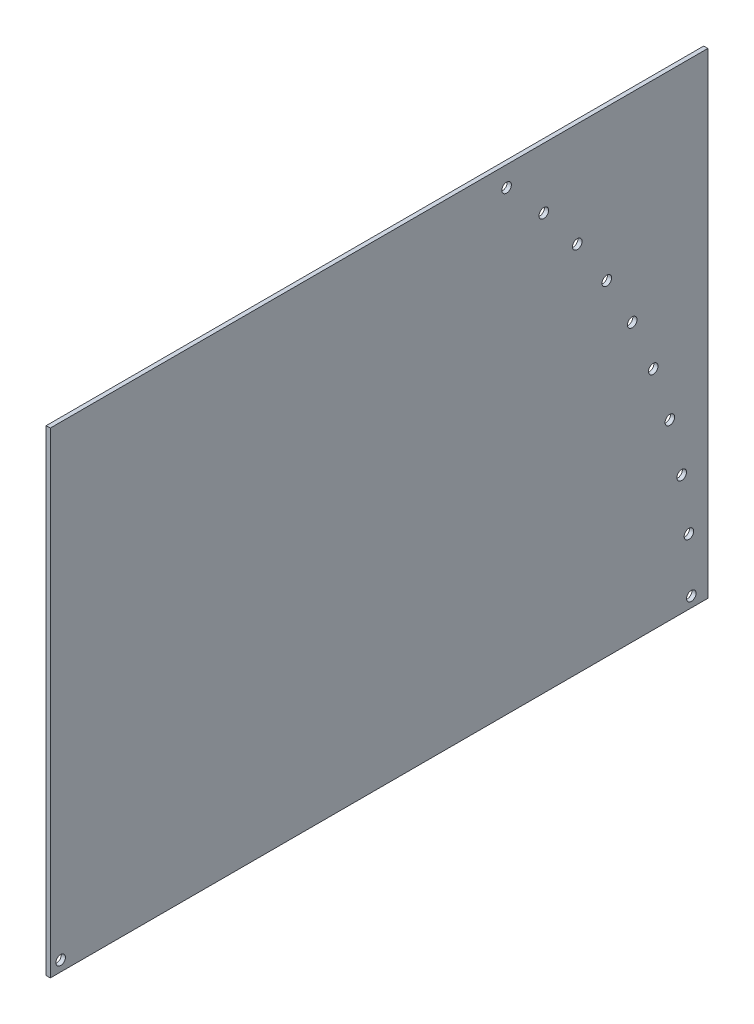
ISO-10303-21;
HEADER;
FILE_DESCRIPTION(('STEP AP214'),'2;1');
FILE_NAME('part.step','',(''),(''),'','','');
FILE_SCHEMA(('AUTOMOTIVE_DESIGN { 1 0 10303 214 1 1 1 1 }'));
ENDSEC;
DATA;
#1=APPLICATION_CONTEXT('core data for automotive mechanical design processes');
#2=APPLICATION_PROTOCOL_DEFINITION('international standard','automotive_design',2000,#1);
#3=PRODUCT_CONTEXT('',#1,'mechanical');
#4=PRODUCT('Part','Part','',(#3));
#5=PRODUCT_RELATED_PRODUCT_CATEGORY('part','',(#4));
#6=PRODUCT_DEFINITION_FORMATION('','',#4);
#7=PRODUCT_DEFINITION_CONTEXT('part definition',#1,'design');
#8=PRODUCT_DEFINITION('design','',#6,#7);
#9=PRODUCT_DEFINITION_SHAPE('','',#8);
#10=(LENGTH_UNIT() NAMED_UNIT(*) SI_UNIT(.MILLI.,.METRE.));
#11=(NAMED_UNIT(*) PLANE_ANGLE_UNIT() SI_UNIT($,.RADIAN.));
#12=(NAMED_UNIT(*) SI_UNIT($,.STERADIAN.) SOLID_ANGLE_UNIT());
#13=UNCERTAINTY_MEASURE_WITH_UNIT(LENGTH_MEASURE(1.E-05),#10,'distance_accuracy_value','');
#14=(GEOMETRIC_REPRESENTATION_CONTEXT(3) GLOBAL_UNCERTAINTY_ASSIGNED_CONTEXT((#13)) GLOBAL_UNIT_ASSIGNED_CONTEXT((#10,
#11,#12)) REPRESENTATION_CONTEXT('',''));
#15=CARTESIAN_POINT('',(0.,0.,0.));
#16=DIRECTION('',(0.,0.,1.));
#17=DIRECTION('',(1.,0.,0.));
#18=AXIS2_PLACEMENT_3D('',#15,#16,#17);
#19=CARTESIAN_POINT('',(2.54,0.,0.));
#20=DIRECTION('',(-1.,0.,0.));
#21=DIRECTION('',(0.,0.,1.));
#22=AXIS2_PLACEMENT_3D('',#19,#20,#21);
#23=PLANE('',#22);
#24=DIRECTION('',(0.,-1.,0.));
#25=VECTOR('',#24,1.);
#26=CARTESIAN_POINT('',(2.54,0.,0.));
#27=LINE('',#26,#25);
#28=CARTESIAN_POINT('',(2.54,291.062175581179,0.));
#29=VERTEX_POINT('',#28);
#30=CARTESIAN_POINT('',(2.54,0.,0.));
#31=VERTEX_POINT('',#30);
#32=EDGE_CURVE('E88',#29,#31,#27,.T.);
#33=ORIENTED_EDGE('',*,*,#32,.T.);
#34=DIRECTION('',(0.,0.,-1.));
#35=VECTOR('',#34,1.);
#36=CARTESIAN_POINT('',(2.54,0.,0.));
#37=LINE('',#36,#35);
#38=CARTESIAN_POINT('',(2.54,0.,-401.869209934692));
#39=VERTEX_POINT('',#38);
#40=EDGE_CURVE('E83',#31,#39,#37,.T.);
#41=ORIENTED_EDGE('',*,*,#40,.T.);
#42=DIRECTION('',(0.,1.,0.));
#43=VECTOR('',#42,1.);
#44=CARTESIAN_POINT('',(2.54,0.,-401.869209934692));
#45=LINE('',#44,#43);
#46=CARTESIAN_POINT('',(2.54,291.062175581179,-401.869209934692));
#47=VERTEX_POINT('',#46);
#48=EDGE_CURVE('E86',#39,#47,#45,.T.);
#49=ORIENTED_EDGE('',*,*,#48,.T.);
#50=DIRECTION('',(0.,0.,1.));
#51=VECTOR('',#50,1.);
#52=CARTESIAN_POINT('',(2.54,291.062175581179,0.));
#53=LINE('',#52,#51);
#54=EDGE_CURVE('E53',#47,#29,#53,.T.);
#55=ORIENTED_EDGE('',*,*,#54,.T.);
#56=EDGE_LOOP('',(#33,#41,#49,#55));
#57=FACE_BOUND('',#56,.T.);
#58=CARTESIAN_POINT('',(2.54,6.35,-6.35));
#59=DIRECTION('',(1.,0.,0.));
#60=DIRECTION('',(0.,0.,-1.));
#61=AXIS2_PLACEMENT_3D('',#58,#59,#60);
#62=CIRCLE('',#61,2.921);
#63=CARTESIAN_POINT('',(2.54,6.35,-9.271));
#64=VERTEX_POINT('',#63);
#65=EDGE_CURVE('E103',#64,#64,#62,.T.);
#66=ORIENTED_EDGE('',*,*,#65,.F.);
#67=EDGE_LOOP('',(#66));
#68=FACE_BOUND('',#67,.T.);
#69=CARTESIAN_POINT('',(2.54,6.35,-391.7499912));
#70=DIRECTION('',(1.,0.,0.));
#71=DIRECTION('',(0.,0.,-1.));
#72=AXIS2_PLACEMENT_3D('',#69,#70,#71);
#73=CIRCLE('',#72,2.921);
#74=CARTESIAN_POINT('',(2.54,6.35,-394.6709912));
#75=VERTEX_POINT('',#74);
#76=EDGE_CURVE('E118',#75,#75,#73,.T.);
#77=ORIENTED_EDGE('',*,*,#76,.F.);
#78=EDGE_LOOP('',(#77));
#79=FACE_BOUND('',#78,.T.);
#80=CARTESIAN_POINT('',(2.54,73.274006144731,-385.894899344597));
#81=DIRECTION('',(1.,0.,0.));
#82=DIRECTION('',(0.,0.,-1.));
#83=AXIS2_PLACEMENT_3D('',#80,#81,#82);
#84=CIRCLE('',#83,2.921);
#85=CARTESIAN_POINT('',(2.54,73.274006144731,-388.815899344597));
#86=VERTEX_POINT('',#85);
#87=EDGE_CURVE('E124',#86,#86,#84,.T.);
#88=ORIENTED_EDGE('',*,*,#87,.F.);
#89=EDGE_LOOP('',(#88));
#90=FACE_BOUND('',#89,.T.);
#91=CARTESIAN_POINT('',(2.54,39.939822487977,-390.283427878045));
#92=DIRECTION('',(1.,0.,0.));
#93=DIRECTION('',(0.,0.,-1.));
#94=AXIS2_PLACEMENT_3D('',#91,#92,#93);
#95=CIRCLE('',#94,2.921);
#96=CARTESIAN_POINT('',(2.54,39.939822487977,-393.204427878045));
#97=VERTEX_POINT('',#96);
#98=EDGE_CURVE('E130',#97,#97,#95,.T.);
#99=ORIENTED_EDGE('',*,*,#98,.F.);
#100=EDGE_LOOP('',(#99));
#101=FACE_BOUND('',#100,.T.);
#102=CARTESIAN_POINT('',(2.54,106.098857704904,-378.61780495166));
#103=DIRECTION('',(1.,0.,0.));
#104=DIRECTION('',(0.,0.,-1.));
#105=AXIS2_PLACEMENT_3D('',#102,#103,#104);
#106=CIRCLE('',#105,2.921);
#107=CARTESIAN_POINT('',(2.54,106.098857704904,-381.53880495166));
#108=VERTEX_POINT('',#107);
#109=EDGE_CURVE('E136',#108,#108,#106,.T.);
#110=ORIENTED_EDGE('',*,*,#109,.F.);
#111=EDGE_LOOP('',(#110));
#112=FACE_BOUND('',#111,.T.);
#113=CARTESIAN_POINT('',(2.54,138.164560227936,-368.507527781594));
#114=DIRECTION('',(1.,0.,0.));
#115=DIRECTION('',(0.,0.,-1.));
#116=AXIS2_PLACEMENT_3D('',#113,#114,#115);
#117=CIRCLE('',#116,2.921);
#118=CARTESIAN_POINT('',(2.54,138.164560227936,-371.428527781594));
#119=VERTEX_POINT('',#118);
#120=EDGE_CURVE('E142',#119,#119,#117,.T.);
#121=ORIENTED_EDGE('',*,*,#120,.F.);
#122=EDGE_LOOP('',(#121));
#123=FACE_BOUND('',#122,.T.);
#124=CARTESIAN_POINT('',(2.54,169.227074355825,-355.641013148416));
#125=DIRECTION('',(1.,0.,0.));
#126=DIRECTION('',(0.,0.,-1.));
#127=AXIS2_PLACEMENT_3D('',#124,#125,#126);
#128=CIRCLE('',#127,2.92100000000006);
#129=CARTESIAN_POINT('',(2.54,169.227074355825,-358.562013148416));
#130=VERTEX_POINT('',#129);
#131=EDGE_CURVE('E148',#130,#130,#128,.T.);
#132=ORIENTED_EDGE('',*,*,#131,.F.);
#133=EDGE_LOOP('',(#132));
#134=FACE_BOUND('',#133,.T.);
#135=CARTESIAN_POINT('',(2.54,199.0499956,-340.116182997499));
#136=DIRECTION('',(1.,0.,0.));
#137=DIRECTION('',(0.,0.,-1.));
#138=AXIS2_PLACEMENT_3D('',#135,#136,#137);
#139=CIRCLE('',#138,2.92099999999994);
#140=CARTESIAN_POINT('',(2.54,199.0499956,-343.037182997499));
#141=VERTEX_POINT('',#140);
#142=EDGE_CURVE('E154',#141,#141,#139,.T.);
#143=ORIENTED_EDGE('',*,*,#142,.F.);
#144=EDGE_LOOP('',(#143));
#145=FACE_BOUND('',#144,.T.);
#146=CARTESIAN_POINT('',(2.54,227.406353522221,-322.051190660439));
#147=DIRECTION('',(1.,0.,0.));
#148=DIRECTION('',(0.,0.,-1.));
#149=AXIS2_PLACEMENT_3D('',#146,#147,#148);
#150=CIRCLE('',#149,2.92100000000006);
#151=CARTESIAN_POINT('',(2.54,227.406353522221,-324.972190660439));
#152=VERTEX_POINT('',#151);
#153=EDGE_CURVE('E160',#152,#152,#150,.T.);
#154=ORIENTED_EDGE('',*,*,#153,.F.);
#155=EDGE_LOOP('',(#154));
#156=FACE_BOUND('',#155,.T.);
#157=CARTESIAN_POINT('',(2.54,254.080339116662,-301.583521636863));
#158=DIRECTION('',(1.,0.,0.));
#159=DIRECTION('',(0.,0.,-1.));
#160=AXIS2_PLACEMENT_3D('',#157,#158,#159);
#161=CIRCLE('',#160,2.92099999999994);
#162=CARTESIAN_POINT('',(2.54,254.080339116662,-304.504521636863));
#163=VERTEX_POINT('',#162);
#164=EDGE_CURVE('E166',#163,#163,#161,.T.);
#165=ORIENTED_EDGE('',*,*,#164,.F.);
#166=EDGE_LOOP('',(#165));
#167=FACE_BOUND('',#166,.T.);
#168=CARTESIAN_POINT('',(2.54,278.868947246756,-278.868947246755));
#169=DIRECTION('',(1.,0.,0.));
#170=DIRECTION('',(0.,0.,-1.));
#171=AXIS2_PLACEMENT_3D('',#168,#169,#170);
#172=CIRCLE('',#171,2.9210000000001);
#173=CARTESIAN_POINT('',(2.54,278.868947246756,-281.789947246756));
#174=VERTEX_POINT('',#173);
#175=EDGE_CURVE('E172',#174,#174,#172,.T.);
#176=ORIENTED_EDGE('',*,*,#175,.F.);
#177=EDGE_LOOP('',(#176));
#178=FACE_BOUND('',#177,.T.);
#179=ADVANCED_FACE('F36',(#57,#68,#79,#90,#101,#112,#123,#134,#145,#156,#167,#178),#23,.F.);
#180=CARTESIAN_POINT('',(0.,0.,0.));
#181=DIRECTION('',(-1.,0.,0.));
#182=DIRECTION('',(0.,0.,1.));
#183=AXIS2_PLACEMENT_3D('',#180,#181,#182);
#184=PLANE('',#183);
#185=CARTESIAN_POINT('',(0.,254.080339116662,-301.583521636863));
#186=DIRECTION('',(1.,0.,0.));
#187=DIRECTION('',(0.,0.,-1.));
#188=AXIS2_PLACEMENT_3D('',#185,#186,#187);
#189=CIRCLE('',#188,2.92099999999994);
#190=CARTESIAN_POINT('',(0.,254.080339116662,-304.504521636863));
#191=VERTEX_POINT('',#190);
#192=EDGE_CURVE('E169',#191,#191,#189,.T.);
#193=ORIENTED_EDGE('',*,*,#192,.T.);
#194=EDGE_LOOP('',(#193));
#195=FACE_BOUND('',#194,.T.);
#196=CARTESIAN_POINT('',(0.,199.0499956,-340.116182997499));
#197=DIRECTION('',(1.,0.,0.));
#198=DIRECTION('',(0.,0.,-1.));
#199=AXIS2_PLACEMENT_3D('',#196,#197,#198);
#200=CIRCLE('',#199,2.92099999999994);
#201=CARTESIAN_POINT('',(0.,199.0499956,-343.037182997499));
#202=VERTEX_POINT('',#201);
#203=EDGE_CURVE('E157',#202,#202,#200,.T.);
#204=ORIENTED_EDGE('',*,*,#203,.T.);
#205=EDGE_LOOP('',(#204));
#206=FACE_BOUND('',#205,.T.);
#207=CARTESIAN_POINT('',(0.,138.164560227936,-368.507527781594));
#208=DIRECTION('',(1.,0.,0.));
#209=DIRECTION('',(0.,0.,-1.));
#210=AXIS2_PLACEMENT_3D('',#207,#208,#209);
#211=CIRCLE('',#210,2.921);
#212=CARTESIAN_POINT('',(0.,138.164560227936,-371.428527781594));
#213=VERTEX_POINT('',#212);
#214=EDGE_CURVE('E145',#213,#213,#211,.T.);
#215=ORIENTED_EDGE('',*,*,#214,.T.);
#216=EDGE_LOOP('',(#215));
#217=FACE_BOUND('',#216,.T.);
#218=CARTESIAN_POINT('',(0.,39.939822487977,-390.283427878045));
#219=DIRECTION('',(1.,0.,0.));
#220=DIRECTION('',(0.,0.,-1.));
#221=AXIS2_PLACEMENT_3D('',#218,#219,#220);
#222=CIRCLE('',#221,2.921);
#223=CARTESIAN_POINT('',(0.,39.939822487977,-393.204427878045));
#224=VERTEX_POINT('',#223);
#225=EDGE_CURVE('E133',#224,#224,#222,.T.);
#226=ORIENTED_EDGE('',*,*,#225,.T.);
#227=EDGE_LOOP('',(#226));
#228=FACE_BOUND('',#227,.T.);
#229=CARTESIAN_POINT('',(0.,6.35,-391.7499912));
#230=DIRECTION('',(1.,0.,0.));
#231=DIRECTION('',(0.,0.,-1.));
#232=AXIS2_PLACEMENT_3D('',#229,#230,#231);
#233=CIRCLE('',#232,2.921);
#234=CARTESIAN_POINT('',(0.,6.35,-394.6709912));
#235=VERTEX_POINT('',#234);
#236=EDGE_CURVE('E121',#235,#235,#233,.T.);
#237=ORIENTED_EDGE('',*,*,#236,.T.);
#238=EDGE_LOOP('',(#237));
#239=FACE_BOUND('',#238,.T.);
#240=DIRECTION('',(0.,-1.,0.));
#241=VECTOR('',#240,1.);
#242=CARTESIAN_POINT('',(0.,0.,0.));
#243=LINE('',#242,#241);
#244=CARTESIAN_POINT('',(0.,291.062175581179,0.));
#245=VERTEX_POINT('',#244);
#246=CARTESIAN_POINT('',(0.,0.,0.));
#247=VERTEX_POINT('',#246);
#248=EDGE_CURVE('E100',#245,#247,#243,.T.);
#249=ORIENTED_EDGE('',*,*,#248,.F.);
#250=DIRECTION('',(0.,0.,1.));
#251=VECTOR('',#250,1.);
#252=CARTESIAN_POINT('',(0.,291.062175581179,0.));
#253=LINE('',#252,#251);
#254=CARTESIAN_POINT('',(0.,291.062175581179,-401.869209934692));
#255=VERTEX_POINT('',#254);
#256=EDGE_CURVE('E76',#255,#245,#253,.T.);
#257=ORIENTED_EDGE('',*,*,#256,.F.);
#258=DIRECTION('',(0.,1.,0.));
#259=VECTOR('',#258,1.);
#260=CARTESIAN_POINT('',(0.,0.,-401.869209934692));
#261=LINE('',#260,#259);
#262=CARTESIAN_POINT('',(0.,0.,-401.869209934692));
#263=VERTEX_POINT('',#262);
#264=EDGE_CURVE('E70',#263,#255,#261,.T.);
#265=ORIENTED_EDGE('',*,*,#264,.F.);
#266=DIRECTION('',(0.,0.,-1.));
#267=VECTOR('',#266,1.);
#268=CARTESIAN_POINT('',(0.,0.,0.));
#269=LINE('',#268,#267);
#270=EDGE_CURVE('E92',#247,#263,#269,.T.);
#271=ORIENTED_EDGE('',*,*,#270,.F.);
#272=EDGE_LOOP('',(#249,#257,#265,#271));
#273=FACE_BOUND('',#272,.T.);
#274=CARTESIAN_POINT('',(0.,6.35,-6.35));
#275=DIRECTION('',(1.,0.,0.));
#276=DIRECTION('',(0.,0.,-1.));
#277=AXIS2_PLACEMENT_3D('',#274,#275,#276);
#278=CIRCLE('',#277,2.921);
#279=CARTESIAN_POINT('',(0.,6.35,-9.271));
#280=VERTEX_POINT('',#279);
#281=EDGE_CURVE('E115',#280,#280,#278,.T.);
#282=ORIENTED_EDGE('',*,*,#281,.T.);
#283=EDGE_LOOP('',(#282));
#284=FACE_BOUND('',#283,.T.);
#285=CARTESIAN_POINT('',(0.,73.274006144731,-385.894899344597));
#286=DIRECTION('',(1.,0.,0.));
#287=DIRECTION('',(0.,0.,-1.));
#288=AXIS2_PLACEMENT_3D('',#285,#286,#287);
#289=CIRCLE('',#288,2.921);
#290=CARTESIAN_POINT('',(0.,73.274006144731,-388.815899344597));
#291=VERTEX_POINT('',#290);
#292=EDGE_CURVE('E127',#291,#291,#289,.T.);
#293=ORIENTED_EDGE('',*,*,#292,.T.);
#294=EDGE_LOOP('',(#293));
#295=FACE_BOUND('',#294,.T.);
#296=CARTESIAN_POINT('',(0.,106.098857704904,-378.61780495166));
#297=DIRECTION('',(1.,0.,0.));
#298=DIRECTION('',(0.,0.,-1.));
#299=AXIS2_PLACEMENT_3D('',#296,#297,#298);
#300=CIRCLE('',#299,2.921);
#301=CARTESIAN_POINT('',(0.,106.098857704904,-381.53880495166));
#302=VERTEX_POINT('',#301);
#303=EDGE_CURVE('E139',#302,#302,#300,.T.);
#304=ORIENTED_EDGE('',*,*,#303,.T.);
#305=EDGE_LOOP('',(#304));
#306=FACE_BOUND('',#305,.T.);
#307=CARTESIAN_POINT('',(0.,169.227074355825,-355.641013148416));
#308=DIRECTION('',(1.,0.,0.));
#309=DIRECTION('',(0.,0.,-1.));
#310=AXIS2_PLACEMENT_3D('',#307,#308,#309);
#311=CIRCLE('',#310,2.92100000000006);
#312=CARTESIAN_POINT('',(0.,169.227074355825,-358.562013148416));
#313=VERTEX_POINT('',#312);
#314=EDGE_CURVE('E151',#313,#313,#311,.T.);
#315=ORIENTED_EDGE('',*,*,#314,.T.);
#316=EDGE_LOOP('',(#315));
#317=FACE_BOUND('',#316,.T.);
#318=CARTESIAN_POINT('',(0.,227.406353522221,-322.051190660439));
#319=DIRECTION('',(1.,0.,0.));
#320=DIRECTION('',(0.,0.,-1.));
#321=AXIS2_PLACEMENT_3D('',#318,#319,#320);
#322=CIRCLE('',#321,2.92100000000006);
#323=CARTESIAN_POINT('',(0.,227.406353522221,-324.972190660439));
#324=VERTEX_POINT('',#323);
#325=EDGE_CURVE('E163',#324,#324,#322,.T.);
#326=ORIENTED_EDGE('',*,*,#325,.T.);
#327=EDGE_LOOP('',(#326));
#328=FACE_BOUND('',#327,.T.);
#329=CARTESIAN_POINT('',(0.,278.868947246756,-278.868947246755));
#330=DIRECTION('',(1.,0.,0.));
#331=DIRECTION('',(0.,0.,-1.));
#332=AXIS2_PLACEMENT_3D('',#329,#330,#331);
#333=CIRCLE('',#332,2.9210000000001);
#334=CARTESIAN_POINT('',(0.,278.868947246756,-281.789947246756));
#335=VERTEX_POINT('',#334);
#336=EDGE_CURVE('E175',#335,#335,#333,.T.);
#337=ORIENTED_EDGE('',*,*,#336,.T.);
#338=EDGE_LOOP('',(#337));
#339=FACE_BOUND('',#338,.T.);
#340=ADVANCED_FACE('F111',(#195,#206,#217,#228,#239,#273,#284,#295,#306,#317,#328,#339),#184,.T.);
#341=CARTESIAN_POINT('',(2.54,0.,0.));
#342=DIRECTION('',(0.,0.,-1.));
#343=DIRECTION('',(-1.,0.,0.));
#344=AXIS2_PLACEMENT_3D('',#341,#342,#343);
#345=PLANE('',#344);
#346=ORIENTED_EDGE('',*,*,#248,.T.);
#347=DIRECTION('',(-1.,0.,0.));
#348=VECTOR('',#347,1.);
#349=CARTESIAN_POINT('',(2.54,0.,0.));
#350=LINE('',#349,#348);
#351=EDGE_CURVE('E11',#31,#247,#350,.T.);
#352=ORIENTED_EDGE('',*,*,#351,.F.);
#353=ORIENTED_EDGE('',*,*,#32,.F.);
#354=DIRECTION('',(-1.,0.,0.));
#355=VECTOR('',#354,1.);
#356=CARTESIAN_POINT('',(2.54,291.062175581179,0.));
#357=LINE('',#356,#355);
#358=EDGE_CURVE('E96',#29,#245,#357,.T.);
#359=ORIENTED_EDGE('',*,*,#358,.T.);
#360=EDGE_LOOP('',(#346,#352,#353,#359));
#361=FACE_BOUND('',#360,.T.);
#362=ADVANCED_FACE('F38',(#361),#345,.F.);
#363=CARTESIAN_POINT('',(2.54,0.,0.));
#364=DIRECTION('',(0.,1.,0.));
#365=DIRECTION('',(0.,0.,1.));
#366=AXIS2_PLACEMENT_3D('',#363,#364,#365);
#367=PLANE('',#366);
#368=ORIENTED_EDGE('',*,*,#270,.T.);
#369=DIRECTION('',(-1.,0.,0.));
#370=VECTOR('',#369,1.);
#371=CARTESIAN_POINT('',(2.54,0.,-401.869209934692));
#372=LINE('',#371,#370);
#373=EDGE_CURVE('E45',#39,#263,#372,.T.);
#374=ORIENTED_EDGE('',*,*,#373,.F.);
#375=ORIENTED_EDGE('',*,*,#40,.F.);
#376=ORIENTED_EDGE('',*,*,#351,.T.);
#377=EDGE_LOOP('',(#368,#374,#375,#376));
#378=FACE_BOUND('',#377,.T.);
#379=ADVANCED_FACE('F91',(#378),#367,.F.);
#380=CARTESIAN_POINT('',(2.54,0.,-401.869209934692));
#381=DIRECTION('',(0.,0.,1.));
#382=DIRECTION('',(1.,0.,0.));
#383=AXIS2_PLACEMENT_3D('',#380,#381,#382);
#384=PLANE('',#383);
#385=ORIENTED_EDGE('',*,*,#264,.T.);
#386=DIRECTION('',(-1.,0.,0.));
#387=VECTOR('',#386,1.);
#388=CARTESIAN_POINT('',(2.54,291.062175581179,-401.869209934692));
#389=LINE('',#388,#387);
#390=EDGE_CURVE('E93',#47,#255,#389,.T.);
#391=ORIENTED_EDGE('',*,*,#390,.F.);
#392=ORIENTED_EDGE('',*,*,#48,.F.);
#393=ORIENTED_EDGE('',*,*,#373,.T.);
#394=EDGE_LOOP('',(#385,#391,#392,#393));
#395=FACE_BOUND('',#394,.T.);
#396=ADVANCED_FACE('F94',(#395),#384,.F.);
#397=CARTESIAN_POINT('',(2.54,291.062175581179,0.));
#398=DIRECTION('',(0.,-1.,0.));
#399=DIRECTION('',(0.,0.,-1.));
#400=AXIS2_PLACEMENT_3D('',#397,#398,#399);
#401=PLANE('',#400);
#402=ORIENTED_EDGE('',*,*,#256,.T.);
#403=ORIENTED_EDGE('',*,*,#358,.F.);
#404=ORIENTED_EDGE('',*,*,#54,.F.);
#405=ORIENTED_EDGE('',*,*,#390,.T.);
#406=EDGE_LOOP('',(#402,#403,#404,#405));
#407=FACE_BOUND('',#406,.T.);
#408=ADVANCED_FACE('F108',(#407),#401,.F.);
#409=CARTESIAN_POINT('',(2.54,6.35,-6.35));
#410=DIRECTION('',(-1.,0.,0.));
#411=DIRECTION('',(0.,0.,1.));
#412=AXIS2_PLACEMENT_3D('',#409,#410,#411);
#413=CYLINDRICAL_SURFACE('',#412,2.921);
#414=ORIENTED_EDGE('',*,*,#65,.T.);
#415=EDGE_LOOP('',(#414));
#416=FACE_BOUND('',#415,.T.);
#417=ORIENTED_EDGE('',*,*,#281,.F.);
#418=EDGE_LOOP('',(#417));
#419=FACE_BOUND('',#418,.T.);
#420=ADVANCED_FACE('F192',(#416,#419),#413,.F.);
#421=CARTESIAN_POINT('',(2.54,6.35,-391.7499912));
#422=DIRECTION('',(-1.,0.,0.));
#423=DIRECTION('',(0.,0.,1.));
#424=AXIS2_PLACEMENT_3D('',#421,#422,#423);
#425=CYLINDRICAL_SURFACE('',#424,2.921);
#426=ORIENTED_EDGE('',*,*,#76,.T.);
#427=EDGE_LOOP('',(#426));
#428=FACE_BOUND('',#427,.T.);
#429=ORIENTED_EDGE('',*,*,#236,.F.);
#430=EDGE_LOOP('',(#429));
#431=FACE_BOUND('',#430,.T.);
#432=ADVANCED_FACE('F238',(#428,#431),#425,.F.);
#433=CARTESIAN_POINT('',(2.54,73.274006144731,-385.894899344597));
#434=DIRECTION('',(-1.,0.,0.));
#435=DIRECTION('',(0.,0.,1.));
#436=AXIS2_PLACEMENT_3D('',#433,#434,#435);
#437=CYLINDRICAL_SURFACE('',#436,2.921);
#438=ORIENTED_EDGE('',*,*,#87,.T.);
#439=EDGE_LOOP('',(#438));
#440=FACE_BOUND('',#439,.T.);
#441=ORIENTED_EDGE('',*,*,#292,.F.);
#442=EDGE_LOOP('',(#441));
#443=FACE_BOUND('',#442,.T.);
#444=ADVANCED_FACE('F246',(#440,#443),#437,.F.);
#445=CARTESIAN_POINT('',(2.54,39.939822487977,-390.283427878045));
#446=DIRECTION('',(-1.,0.,0.));
#447=DIRECTION('',(0.,0.,1.));
#448=AXIS2_PLACEMENT_3D('',#445,#446,#447);
#449=CYLINDRICAL_SURFACE('',#448,2.921);
#450=ORIENTED_EDGE('',*,*,#98,.T.);
#451=EDGE_LOOP('',(#450));
#452=FACE_BOUND('',#451,.T.);
#453=ORIENTED_EDGE('',*,*,#225,.F.);
#454=EDGE_LOOP('',(#453));
#455=FACE_BOUND('',#454,.T.);
#456=ADVANCED_FACE('F254',(#452,#455),#449,.F.);
#457=CARTESIAN_POINT('',(2.54,106.098857704904,-378.61780495166));
#458=DIRECTION('',(-1.,0.,0.));
#459=DIRECTION('',(0.,0.,1.));
#460=AXIS2_PLACEMENT_3D('',#457,#458,#459);
#461=CYLINDRICAL_SURFACE('',#460,2.921);
#462=ORIENTED_EDGE('',*,*,#109,.T.);
#463=EDGE_LOOP('',(#462));
#464=FACE_BOUND('',#463,.T.);
#465=ORIENTED_EDGE('',*,*,#303,.F.);
#466=EDGE_LOOP('',(#465));
#467=FACE_BOUND('',#466,.T.);
#468=ADVANCED_FACE('F263',(#464,#467),#461,.F.);
#469=CARTESIAN_POINT('',(2.54,138.164560227936,-368.507527781594));
#470=DIRECTION('',(-1.,0.,0.));
#471=DIRECTION('',(0.,0.,1.));
#472=AXIS2_PLACEMENT_3D('',#469,#470,#471);
#473=CYLINDRICAL_SURFACE('',#472,2.921);
#474=ORIENTED_EDGE('',*,*,#120,.T.);
#475=EDGE_LOOP('',(#474));
#476=FACE_BOUND('',#475,.T.);
#477=ORIENTED_EDGE('',*,*,#214,.F.);
#478=EDGE_LOOP('',(#477));
#479=FACE_BOUND('',#478,.T.);
#480=ADVANCED_FACE('F272',(#476,#479),#473,.F.);
#481=CARTESIAN_POINT('',(2.54,169.227074355825,-355.641013148416));
#482=DIRECTION('',(-1.,0.,0.));
#483=DIRECTION('',(0.,0.,1.));
#484=AXIS2_PLACEMENT_3D('',#481,#482,#483);
#485=CYLINDRICAL_SURFACE('',#484,2.92100000000006);
#486=ORIENTED_EDGE('',*,*,#131,.T.);
#487=EDGE_LOOP('',(#486));
#488=FACE_BOUND('',#487,.T.);
#489=ORIENTED_EDGE('',*,*,#314,.F.);
#490=EDGE_LOOP('',(#489));
#491=FACE_BOUND('',#490,.T.);
#492=ADVANCED_FACE('F281',(#488,#491),#485,.F.);
#493=CARTESIAN_POINT('',(2.54,199.0499956,-340.116182997499));
#494=DIRECTION('',(-1.,0.,0.));
#495=DIRECTION('',(0.,0.,1.));
#496=AXIS2_PLACEMENT_3D('',#493,#494,#495);
#497=CYLINDRICAL_SURFACE('',#496,2.92099999999994);
#498=ORIENTED_EDGE('',*,*,#142,.T.);
#499=EDGE_LOOP('',(#498));
#500=FACE_BOUND('',#499,.T.);
#501=ORIENTED_EDGE('',*,*,#203,.F.);
#502=EDGE_LOOP('',(#501));
#503=FACE_BOUND('',#502,.T.);
#504=ADVANCED_FACE('F290',(#500,#503),#497,.F.);
#505=CARTESIAN_POINT('',(2.54,227.406353522221,-322.051190660439));
#506=DIRECTION('',(-1.,0.,0.));
#507=DIRECTION('',(0.,0.,1.));
#508=AXIS2_PLACEMENT_3D('',#505,#506,#507);
#509=CYLINDRICAL_SURFACE('',#508,2.92100000000006);
#510=ORIENTED_EDGE('',*,*,#153,.T.);
#511=EDGE_LOOP('',(#510));
#512=FACE_BOUND('',#511,.T.);
#513=ORIENTED_EDGE('',*,*,#325,.F.);
#514=EDGE_LOOP('',(#513));
#515=FACE_BOUND('',#514,.T.);
#516=ADVANCED_FACE('F299',(#512,#515),#509,.F.);
#517=CARTESIAN_POINT('',(2.54,254.080339116662,-301.583521636863));
#518=DIRECTION('',(-1.,0.,0.));
#519=DIRECTION('',(0.,0.,1.));
#520=AXIS2_PLACEMENT_3D('',#517,#518,#519);
#521=CYLINDRICAL_SURFACE('',#520,2.92099999999994);
#522=ORIENTED_EDGE('',*,*,#164,.T.);
#523=EDGE_LOOP('',(#522));
#524=FACE_BOUND('',#523,.T.);
#525=ORIENTED_EDGE('',*,*,#192,.F.);
#526=EDGE_LOOP('',(#525));
#527=FACE_BOUND('',#526,.T.);
#528=ADVANCED_FACE('F308',(#524,#527),#521,.F.);
#529=CARTESIAN_POINT('',(2.54,278.868947246756,-278.868947246755));
#530=DIRECTION('',(-1.,0.,0.));
#531=DIRECTION('',(0.,0.,1.));
#532=AXIS2_PLACEMENT_3D('',#529,#530,#531);
#533=CYLINDRICAL_SURFACE('',#532,2.9210000000001);
#534=ORIENTED_EDGE('',*,*,#175,.T.);
#535=EDGE_LOOP('',(#534));
#536=FACE_BOUND('',#535,.T.);
#537=ORIENTED_EDGE('',*,*,#336,.F.);
#538=EDGE_LOOP('',(#537));
#539=FACE_BOUND('',#538,.T.);
#540=ADVANCED_FACE('F181',(#536,#539),#533,.F.);
#541=CLOSED_SHELL('',(#179,#340,#362,#379,#396,#408,#420,#432,#444,#456,#468,#480,#492,#504,
#516,#528,#540));
#542=MANIFOLD_SOLID_BREP('B2',#541);
#543=ADVANCED_BREP_SHAPE_REPRESENTATION('',(#18,#542),#14);
#544=SHAPE_DEFINITION_REPRESENTATION(#9,#543);
ENDSEC;
END-ISO-10303-21;
